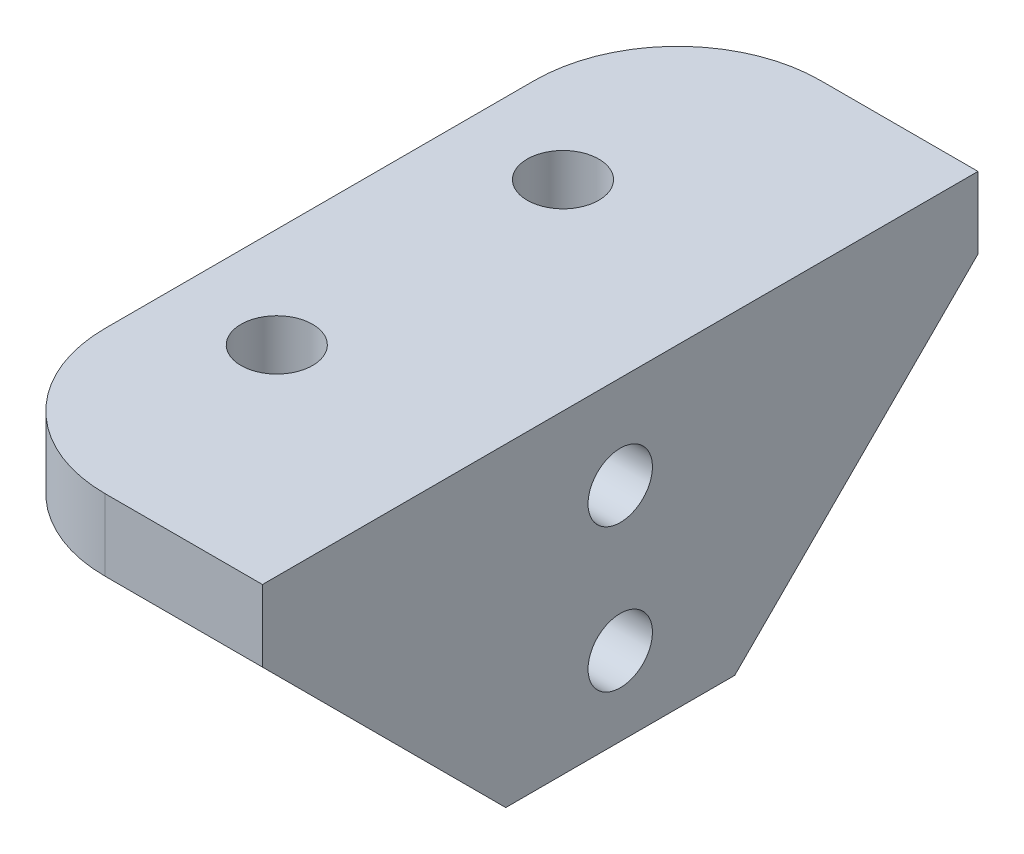
ISO-10303-21;
HEADER;
FILE_DESCRIPTION(('STEP AP214'),'2;1');
FILE_NAME('part.step','',(''),(''),'','','');
FILE_SCHEMA(('AUTOMOTIVE_DESIGN { 1 0 10303 214 1 1 1 1 }'));
ENDSEC;
DATA;
#1=APPLICATION_CONTEXT('core data for automotive mechanical design processes');
#2=APPLICATION_PROTOCOL_DEFINITION('international standard','automotive_design',2000,#1);
#3=PRODUCT_CONTEXT('',#1,'mechanical');
#4=PRODUCT('Part','Part','',(#3));
#5=PRODUCT_RELATED_PRODUCT_CATEGORY('part','',(#4));
#6=PRODUCT_DEFINITION_FORMATION('','',#4);
#7=PRODUCT_DEFINITION_CONTEXT('part definition',#1,'design');
#8=PRODUCT_DEFINITION('design','',#6,#7);
#9=PRODUCT_DEFINITION_SHAPE('','',#8);
#10=(LENGTH_UNIT() NAMED_UNIT(*) SI_UNIT(.MILLI.,.METRE.));
#11=(NAMED_UNIT(*) PLANE_ANGLE_UNIT() SI_UNIT($,.RADIAN.));
#12=(NAMED_UNIT(*) SI_UNIT($,.STERADIAN.) SOLID_ANGLE_UNIT());
#13=UNCERTAINTY_MEASURE_WITH_UNIT(LENGTH_MEASURE(1.E-05),#10,'distance_accuracy_value','');
#14=(GEOMETRIC_REPRESENTATION_CONTEXT(3) GLOBAL_UNCERTAINTY_ASSIGNED_CONTEXT((#13)) GLOBAL_UNIT_ASSIGNED_CONTEXT((#10,
#11,#12)) REPRESENTATION_CONTEXT('',''));
#15=CARTESIAN_POINT('',(0.,0.,0.));
#16=DIRECTION('',(0.,0.,1.));
#17=DIRECTION('',(1.,0.,0.));
#18=AXIS2_PLACEMENT_3D('',#15,#16,#17);
#19=CARTESIAN_POINT('',(15.,0.,0.));
#20=DIRECTION('',(1.,0.,0.));
#21=DIRECTION('',(0.,0.,-1.));
#22=AXIS2_PLACEMENT_3D('',#19,#20,#21);
#23=PLANE('',#22);
#24=DIRECTION('',(0.,0.,-1.));
#25=VECTOR('',#24,1.);
#26=CARTESIAN_POINT('',(15.,0.,0.));
#27=LINE('',#26,#25);
#28=CARTESIAN_POINT('',(15.,0.,0.));
#29=VERTEX_POINT('',#28);
#30=CARTESIAN_POINT('',(15.,0.,-21.2649464528604));
#31=VERTEX_POINT('',#30);
#32=EDGE_CURVE('E132',#29,#31,#27,.T.);
#33=ORIENTED_EDGE('',*,*,#32,.T.);
#34=CARTESIAN_POINT('',(15.,-1.49999999999999,-25.));
#35=DIRECTION('',(-1.,0.,0.));
#36=DIRECTION('',(0.,0.,1.));
#37=AXIS2_PLACEMENT_3D('',#34,#35,#36);
#38=CIRCLE('',#37,4.025);
#39=CARTESIAN_POINT('',(15.,0.,-28.7350535471396));
#40=VERTEX_POINT('',#39);
#41=EDGE_CURVE('E114',#40,#31,#38,.T.);
#42=ORIENTED_EDGE('',*,*,#41,.F.);
#43=CARTESIAN_POINT('',(15.,0.,-50.));
#44=VERTEX_POINT('',#43);
#45=EDGE_CURVE('E135',#40,#44,#27,.T.);
#46=ORIENTED_EDGE('',*,*,#45,.T.);
#47=DIRECTION('',(0.,0.707106781186548,-0.707106781186548));
#48=VECTOR('',#47,1.);
#49=CARTESIAN_POINT('',(15.,0.,-50.));
#50=LINE('',#49,#48);
#51=CARTESIAN_POINT('',(15.,-17.,-33.));
#52=VERTEX_POINT('',#51);
#53=EDGE_CURVE('E208',#52,#44,#50,.T.);
#54=ORIENTED_EDGE('',*,*,#53,.F.);
#55=DIRECTION('',(0.,0.,-1.));
#56=VECTOR('',#55,1.);
#57=CARTESIAN_POINT('',(15.,-17.,-17.));
#58=LINE('',#57,#56);
#59=CARTESIAN_POINT('',(15.,-17.,-17.));
#60=VERTEX_POINT('',#59);
#61=EDGE_CURVE('E202',#60,#52,#58,.T.);
#62=ORIENTED_EDGE('',*,*,#61,.F.);
#63=DIRECTION('',(0.,-0.707106781186547,-0.707106781186548));
#64=VECTOR('',#63,1.);
#65=CARTESIAN_POINT('',(15.,0.,0.));
#66=LINE('',#65,#64);
#67=EDGE_CURVE('E141',#29,#60,#66,.T.);
#68=ORIENTED_EDGE('',*,*,#67,.F.);
#69=EDGE_LOOP('',(#33,#42,#46,#54,#62,#68));
#70=FACE_BOUND('',#69,.T.);
#71=CARTESIAN_POINT('',(15.,-11.5,-25.));
#72=DIRECTION('',(-1.,0.,0.));
#73=DIRECTION('',(0.,0.,1.));
#74=AXIS2_PLACEMENT_3D('',#71,#72,#73);
#75=CIRCLE('',#74,4.025);
#76=CARTESIAN_POINT('',(15.,-11.5,-20.975));
#77=VERTEX_POINT('',#76);
#78=EDGE_CURVE('E261',#77,#77,#75,.T.);
#79=ORIENTED_EDGE('',*,*,#78,.F.);
#80=EDGE_LOOP('',(#79));
#81=FACE_BOUND('',#80,.T.);
#82=ADVANCED_FACE('F39',(#70,#81),#23,.F.);
#83=CARTESIAN_POINT('',(0.,5.,0.));
#84=DIRECTION('',(1.,0.,0.));
#85=DIRECTION('',(0.,0.,-1.));
#86=AXIS2_PLACEMENT_3D('',#83,#84,#85);
#87=PLANE('',#86);
#88=DIRECTION('',(0.,0.,1.));
#89=VECTOR('',#88,1.);
#90=CARTESIAN_POINT('',(0.,0.,0.));
#91=LINE('',#90,#89);
#92=CARTESIAN_POINT('',(0.,0.,-40.));
#93=VERTEX_POINT('',#92);
#94=CARTESIAN_POINT('',(0.,0.,-10.));
#95=VERTEX_POINT('',#94);
#96=EDGE_CURVE('E152',#93,#95,#91,.T.);
#97=ORIENTED_EDGE('',*,*,#96,.T.);
#98=DIRECTION('',(0.,-1.,0.));
#99=VECTOR('',#98,1.);
#100=CARTESIAN_POINT('',(0.,5.,-10.));
#101=LINE('',#100,#99);
#102=CARTESIAN_POINT('',(0.,5.,-10.));
#103=VERTEX_POINT('',#102);
#104=EDGE_CURVE('E321',#95,#103,#101,.F.);
#105=ORIENTED_EDGE('',*,*,#104,.T.);
#106=DIRECTION('',(0.,0.,1.));
#107=VECTOR('',#106,1.);
#108=CARTESIAN_POINT('',(0.,5.,0.));
#109=LINE('',#108,#107);
#110=CARTESIAN_POINT('',(0.,5.,-40.));
#111=VERTEX_POINT('',#110);
#112=EDGE_CURVE('E145',#111,#103,#109,.T.);
#113=ORIENTED_EDGE('',*,*,#112,.F.);
#114=DIRECTION('',(0.,-1.,0.));
#115=VECTOR('',#114,1.);
#116=CARTESIAN_POINT('',(0.,5.,-40.));
#117=LINE('',#116,#115);
#118=EDGE_CURVE('E331',#111,#93,#117,.T.);
#119=ORIENTED_EDGE('',*,*,#118,.T.);
#120=EDGE_LOOP('',(#97,#105,#113,#119));
#121=FACE_BOUND('',#120,.T.);
#122=ADVANCED_FACE('F268',(#121),#87,.F.);
#123=CARTESIAN_POINT('',(0.,5.,0.));
#124=DIRECTION('',(0.,0.,-1.));
#125=DIRECTION('',(-1.,0.,0.));
#126=AXIS2_PLACEMENT_3D('',#123,#124,#125);
#127=PLANE('',#126);
#128=DIRECTION('',(1.,0.,0.));
#129=VECTOR('',#128,1.);
#130=CARTESIAN_POINT('',(0.,5.,0.));
#131=LINE('',#130,#129);
#132=CARTESIAN_POINT('',(10.,5.,0.));
#133=VERTEX_POINT('',#132);
#134=CARTESIAN_POINT('',(21.,5.,0.));
#135=VERTEX_POINT('',#134);
#136=EDGE_CURVE('E165',#133,#135,#131,.T.);
#137=ORIENTED_EDGE('',*,*,#136,.F.);
#138=DIRECTION('',(0.,-1.,0.));
#139=VECTOR('',#138,1.);
#140=CARTESIAN_POINT('',(10.,5.,0.));
#141=LINE('',#140,#139);
#142=CARTESIAN_POINT('',(10.,0.,0.));
#143=VERTEX_POINT('',#142);
#144=EDGE_CURVE('E164',#133,#143,#141,.T.);
#145=ORIENTED_EDGE('',*,*,#144,.T.);
#146=DIRECTION('',(1.,0.,0.));
#147=VECTOR('',#146,1.);
#148=CARTESIAN_POINT('',(0.,0.,0.));
#149=LINE('',#148,#147);
#150=EDGE_CURVE('E149',#143,#29,#149,.T.);
#151=ORIENTED_EDGE('',*,*,#150,.T.);
#152=DIRECTION('',(-1.,0.,0.));
#153=VECTOR('',#152,1.);
#154=CARTESIAN_POINT('',(21.,0.,0.));
#155=LINE('',#154,#153);
#156=CARTESIAN_POINT('',(21.,0.,0.));
#157=VERTEX_POINT('',#156);
#158=EDGE_CURVE('E190',#157,#29,#155,.T.);
#159=ORIENTED_EDGE('',*,*,#158,.F.);
#160=DIRECTION('',(0.,-1.,0.));
#161=VECTOR('',#160,1.);
#162=CARTESIAN_POINT('',(21.,5.,0.));
#163=LINE('',#162,#161);
#164=EDGE_CURVE('E218',#135,#157,#163,.T.);
#165=ORIENTED_EDGE('',*,*,#164,.F.);
#166=EDGE_LOOP('',(#137,#145,#151,#159,#165));
#167=FACE_BOUND('',#166,.T.);
#168=ADVANCED_FACE('F275',(#167),#127,.F.);
#169=CARTESIAN_POINT('',(0.,5.,-50.));
#170=DIRECTION('',(0.,0.,1.));
#171=DIRECTION('',(1.,0.,0.));
#172=AXIS2_PLACEMENT_3D('',#169,#170,#171);
#173=PLANE('',#172);
#174=DIRECTION('',(-1.,0.,0.));
#175=VECTOR('',#174,1.);
#176=CARTESIAN_POINT('',(0.,0.,-50.));
#177=LINE('',#176,#175);
#178=CARTESIAN_POINT('',(10.,0.,-50.));
#179=VERTEX_POINT('',#178);
#180=EDGE_CURVE('E143',#44,#179,#177,.T.);
#181=ORIENTED_EDGE('',*,*,#180,.T.);
#182=DIRECTION('',(0.,-1.,0.));
#183=VECTOR('',#182,1.);
#184=CARTESIAN_POINT('',(10.,5.,-50.));
#185=LINE('',#184,#183);
#186=CARTESIAN_POINT('',(10.,5.,-50.));
#187=VERTEX_POINT('',#186);
#188=EDGE_CURVE('E11',#179,#187,#185,.F.);
#189=ORIENTED_EDGE('',*,*,#188,.T.);
#190=DIRECTION('',(-1.,0.,0.));
#191=VECTOR('',#190,1.);
#192=CARTESIAN_POINT('',(0.,5.,-50.));
#193=LINE('',#192,#191);
#194=CARTESIAN_POINT('',(21.,5.,-50.));
#195=VERTEX_POINT('',#194);
#196=EDGE_CURVE('E161',#195,#187,#193,.T.);
#197=ORIENTED_EDGE('',*,*,#196,.F.);
#198=DIRECTION('',(0.,1.,0.));
#199=VECTOR('',#198,1.);
#200=CARTESIAN_POINT('',(21.,5.,-50.));
#201=LINE('',#200,#199);
#202=CARTESIAN_POINT('',(21.,0.,-50.));
#203=VERTEX_POINT('',#202);
#204=EDGE_CURVE('E225',#203,#195,#201,.T.);
#205=ORIENTED_EDGE('',*,*,#204,.F.);
#206=DIRECTION('',(-1.,0.,0.));
#207=VECTOR('',#206,1.);
#208=CARTESIAN_POINT('',(21.,0.,-50.));
#209=LINE('',#208,#207);
#210=EDGE_CURVE('E176',#203,#44,#209,.T.);
#211=ORIENTED_EDGE('',*,*,#210,.T.);
#212=EDGE_LOOP('',(#181,#189,#197,#205,#211));
#213=FACE_BOUND('',#212,.T.);
#214=ADVANCED_FACE('F306',(#213),#173,.F.);
#215=CARTESIAN_POINT('',(0.,5.,0.));
#216=DIRECTION('',(0.,-1.,0.));
#217=DIRECTION('',(0.,0.,-1.));
#218=AXIS2_PLACEMENT_3D('',#215,#216,#217);
#219=PLANE('',#218);
#220=CARTESIAN_POINT('',(6.99999999999999,5.,-35.));
#221=DIRECTION('',(0.,1.,0.));
#222=DIRECTION('',(0.,0.,1.));
#223=AXIS2_PLACEMENT_3D('',#220,#221,#222);
#224=CIRCLE('',#223,2.5);
#225=CARTESIAN_POINT('',(6.99999999999999,5.,-32.5));
#226=VERTEX_POINT('',#225);
#227=EDGE_CURVE('E180',#226,#226,#224,.T.);
#228=ORIENTED_EDGE('',*,*,#227,.F.);
#229=EDGE_LOOP('',(#228));
#230=FACE_BOUND('',#229,.T.);
#231=CARTESIAN_POINT('',(6.99999999999999,5.,-15.));
#232=DIRECTION('',(0.,1.,0.));
#233=DIRECTION('',(0.,0.,1.));
#234=AXIS2_PLACEMENT_3D('',#231,#232,#233);
#235=CIRCLE('',#234,2.5);
#236=CARTESIAN_POINT('',(6.99999999999999,5.,-12.5));
#237=VERTEX_POINT('',#236);
#238=EDGE_CURVE('E171',#237,#237,#235,.T.);
#239=ORIENTED_EDGE('',*,*,#238,.F.);
#240=EDGE_LOOP('',(#239));
#241=FACE_BOUND('',#240,.T.);
#242=ORIENTED_EDGE('',*,*,#112,.T.);
#243=CARTESIAN_POINT('',(10.,5.,-10.));
#244=DIRECTION('',(0.,-1.,0.));
#245=DIRECTION('',(0.,0.,-1.));
#246=AXIS2_PLACEMENT_3D('',#243,#244,#245);
#247=CIRCLE('',#246,10.);
#248=EDGE_CURVE('E48',#103,#133,#247,.F.);
#249=ORIENTED_EDGE('',*,*,#248,.T.);
#250=ORIENTED_EDGE('',*,*,#136,.T.);
#251=DIRECTION('',(0.,0.,1.));
#252=VECTOR('',#251,1.);
#253=CARTESIAN_POINT('',(21.,5.,-50.));
#254=LINE('',#253,#252);
#255=EDGE_CURVE('E221',#195,#135,#254,.T.);
#256=ORIENTED_EDGE('',*,*,#255,.F.);
#257=ORIENTED_EDGE('',*,*,#196,.T.);
#258=CARTESIAN_POINT('',(10.,5.,-40.));
#259=DIRECTION('',(0.,-1.,0.));
#260=DIRECTION('',(0.,0.,-1.));
#261=AXIS2_PLACEMENT_3D('',#258,#259,#260);
#262=CIRCLE('',#261,10.);
#263=EDGE_CURVE('E325',#187,#111,#262,.F.);
#264=ORIENTED_EDGE('',*,*,#263,.T.);
#265=EDGE_LOOP('',(#242,#249,#250,#256,#257,#264));
#266=FACE_BOUND('',#265,.T.);
#267=ADVANCED_FACE('F303',(#230,#241,#266),#219,.F.);
#268=CARTESIAN_POINT('',(0.,0.,0.));
#269=DIRECTION('',(0.,-1.,0.));
#270=DIRECTION('',(0.,0.,-1.));
#271=AXIS2_PLACEMENT_3D('',#268,#269,#270);
#272=PLANE('',#271);
#273=CARTESIAN_POINT('',(6.99999999999999,0.,-35.));
#274=DIRECTION('',(0.,1.,0.));
#275=DIRECTION('',(0.,0.,1.));
#276=AXIS2_PLACEMENT_3D('',#273,#274,#275);
#277=CIRCLE('',#276,2.5);
#278=CARTESIAN_POINT('',(6.99999999999999,0.,-32.5));
#279=VERTEX_POINT('',#278);
#280=EDGE_CURVE('E158',#279,#279,#277,.T.);
#281=ORIENTED_EDGE('',*,*,#280,.T.);
#282=EDGE_LOOP('',(#281));
#283=FACE_BOUND('',#282,.T.);
#284=CARTESIAN_POINT('',(6.99999999999999,0.,-15.));
#285=DIRECTION('',(0.,1.,0.));
#286=DIRECTION('',(0.,0.,1.));
#287=AXIS2_PLACEMENT_3D('',#284,#285,#286);
#288=CIRCLE('',#287,2.5);
#289=CARTESIAN_POINT('',(6.99999999999999,0.,-12.5));
#290=VERTEX_POINT('',#289);
#291=EDGE_CURVE('E175',#290,#290,#288,.T.);
#292=ORIENTED_EDGE('',*,*,#291,.T.);
#293=EDGE_LOOP('',(#292));
#294=FACE_BOUND('',#293,.T.);
#295=ORIENTED_EDGE('',*,*,#150,.F.);
#296=CARTESIAN_POINT('',(10.,0.,-10.));
#297=DIRECTION('',(0.,-1.,0.));
#298=DIRECTION('',(0.,0.,-1.));
#299=AXIS2_PLACEMENT_3D('',#296,#297,#298);
#300=CIRCLE('',#299,10.);
#301=EDGE_CURVE('E335',#143,#95,#300,.T.);
#302=ORIENTED_EDGE('',*,*,#301,.T.);
#303=ORIENTED_EDGE('',*,*,#96,.F.);
#304=CARTESIAN_POINT('',(10.,0.,-40.));
#305=DIRECTION('',(0.,-1.,0.));
#306=DIRECTION('',(0.,0.,-1.));
#307=AXIS2_PLACEMENT_3D('',#304,#305,#306);
#308=CIRCLE('',#307,10.);
#309=EDGE_CURVE('E338',#93,#179,#308,.T.);
#310=ORIENTED_EDGE('',*,*,#309,.T.);
#311=ORIENTED_EDGE('',*,*,#180,.F.);
#312=ORIENTED_EDGE('',*,*,#45,.F.);
#313=EDGE_CURVE('E125',#31,#40,#27,.T.);
#314=ORIENTED_EDGE('',*,*,#313,.F.);
#315=ORIENTED_EDGE('',*,*,#32,.F.);
#316=EDGE_LOOP('',(#295,#302,#303,#310,#311,#312,#314,#315));
#317=FACE_BOUND('',#316,.T.);
#318=ADVANCED_FACE('F131',(#283,#294,#317),#272,.T.);
#319=CARTESIAN_POINT('',(6.99999999999999,0.,-15.));
#320=DIRECTION('',(0.,1.,0.));
#321=DIRECTION('',(0.,0.,1.));
#322=AXIS2_PLACEMENT_3D('',#319,#320,#321);
#323=CYLINDRICAL_SURFACE('',#322,2.5);
#324=ORIENTED_EDGE('',*,*,#291,.F.);
#325=EDGE_LOOP('',(#324));
#326=FACE_BOUND('',#325,.T.);
#327=ORIENTED_EDGE('',*,*,#238,.T.);
#328=EDGE_LOOP('',(#327));
#329=FACE_BOUND('',#328,.T.);
#330=ADVANCED_FACE('F298',(#326,#329),#323,.F.);
#331=CARTESIAN_POINT('',(6.99999999999999,0.,-35.));
#332=DIRECTION('',(0.,1.,0.));
#333=DIRECTION('',(0.,0.,1.));
#334=AXIS2_PLACEMENT_3D('',#331,#332,#333);
#335=CYLINDRICAL_SURFACE('',#334,2.5);
#336=ORIENTED_EDGE('',*,*,#280,.F.);
#337=EDGE_LOOP('',(#336));
#338=FACE_BOUND('',#337,.T.);
#339=ORIENTED_EDGE('',*,*,#227,.T.);
#340=EDGE_LOOP('',(#339));
#341=FACE_BOUND('',#340,.T.);
#342=ADVANCED_FACE('F294',(#338,#341),#335,.F.);
#343=CARTESIAN_POINT('',(10.,5.,-10.));
#344=DIRECTION('',(0.,-1.,0.));
#345=DIRECTION('',(0.,0.,-1.));
#346=AXIS2_PLACEMENT_3D('',#343,#344,#345);
#347=CYLINDRICAL_SURFACE('',#346,10.);
#348=ORIENTED_EDGE('',*,*,#248,.F.);
#349=ORIENTED_EDGE('',*,*,#104,.F.);
#350=ORIENTED_EDGE('',*,*,#301,.F.);
#351=ORIENTED_EDGE('',*,*,#144,.F.);
#352=EDGE_LOOP('',(#348,#349,#350,#351));
#353=FACE_BOUND('',#352,.T.);
#354=ADVANCED_FACE('F297',(#353),#347,.T.);
#355=CARTESIAN_POINT('',(10.,5.,-40.));
#356=DIRECTION('',(0.,-1.,0.));
#357=DIRECTION('',(0.,0.,-1.));
#358=AXIS2_PLACEMENT_3D('',#355,#356,#357);
#359=CYLINDRICAL_SURFACE('',#358,10.);
#360=ORIENTED_EDGE('',*,*,#263,.F.);
#361=ORIENTED_EDGE('',*,*,#188,.F.);
#362=ORIENTED_EDGE('',*,*,#309,.F.);
#363=ORIENTED_EDGE('',*,*,#118,.F.);
#364=EDGE_LOOP('',(#360,#361,#362,#363));
#365=FACE_BOUND('',#364,.T.);
#366=ADVANCED_FACE('F41',(#365),#359,.T.);
#367=CARTESIAN_POINT('',(21.,0.,-50.));
#368=DIRECTION('',(0.,0.707106781186547,0.707106781186547));
#369=DIRECTION('',(0.,-0.707106781186548,0.707106781186548));
#370=AXIS2_PLACEMENT_3D('',#367,#368,#369);
#371=PLANE('',#370);
#372=ORIENTED_EDGE('',*,*,#53,.T.);
#373=ORIENTED_EDGE('',*,*,#210,.F.);
#374=DIRECTION('',(0.,0.707106781186548,-0.707106781186548));
#375=VECTOR('',#374,1.);
#376=CARTESIAN_POINT('',(21.,0.,-50.));
#377=LINE('',#376,#375);
#378=CARTESIAN_POINT('',(21.,-17.,-33.));
#379=VERTEX_POINT('',#378);
#380=EDGE_CURVE('E205',#379,#203,#377,.T.);
#381=ORIENTED_EDGE('',*,*,#380,.F.);
#382=DIRECTION('',(-1.,0.,0.));
#383=VECTOR('',#382,1.);
#384=CARTESIAN_POINT('',(21.,-17.,-33.));
#385=LINE('',#384,#383);
#386=EDGE_CURVE('E197',#379,#52,#385,.T.);
#387=ORIENTED_EDGE('',*,*,#386,.T.);
#388=EDGE_LOOP('',(#372,#373,#381,#387));
#389=FACE_BOUND('',#388,.T.);
#390=ADVANCED_FACE('F289',(#389),#371,.F.);
#391=CARTESIAN_POINT('',(21.,0.,0.));
#392=DIRECTION('',(0.,0.707106781186548,-0.707106781186547));
#393=DIRECTION('',(0.,0.707106781186547,0.707106781186548));
#394=AXIS2_PLACEMENT_3D('',#391,#392,#393);
#395=PLANE('',#394);
#396=ORIENTED_EDGE('',*,*,#67,.T.);
#397=DIRECTION('',(-1.,0.,0.));
#398=VECTOR('',#397,1.);
#399=CARTESIAN_POINT('',(21.,-17.,-17.));
#400=LINE('',#399,#398);
#401=CARTESIAN_POINT('',(21.,-17.,-17.));
#402=VERTEX_POINT('',#401);
#403=EDGE_CURVE('E193',#402,#60,#400,.T.);
#404=ORIENTED_EDGE('',*,*,#403,.F.);
#405=DIRECTION('',(0.,-0.707106781186547,-0.707106781186548));
#406=VECTOR('',#405,1.);
#407=CARTESIAN_POINT('',(21.,0.,0.));
#408=LINE('',#407,#406);
#409=EDGE_CURVE('E215',#157,#402,#408,.T.);
#410=ORIENTED_EDGE('',*,*,#409,.F.);
#411=ORIENTED_EDGE('',*,*,#158,.T.);
#412=EDGE_LOOP('',(#396,#404,#410,#411));
#413=FACE_BOUND('',#412,.T.);
#414=ADVANCED_FACE('F285',(#413),#395,.F.);
#415=CARTESIAN_POINT('',(21.,-17.,-17.));
#416=DIRECTION('',(0.,1.,0.));
#417=DIRECTION('',(0.,0.,1.));
#418=AXIS2_PLACEMENT_3D('',#415,#416,#417);
#419=PLANE('',#418);
#420=ORIENTED_EDGE('',*,*,#61,.T.);
#421=ORIENTED_EDGE('',*,*,#386,.F.);
#422=DIRECTION('',(0.,0.,-1.));
#423=VECTOR('',#422,1.);
#424=CARTESIAN_POINT('',(21.,-17.,-17.));
#425=LINE('',#424,#423);
#426=EDGE_CURVE('E201',#402,#379,#425,.T.);
#427=ORIENTED_EDGE('',*,*,#426,.F.);
#428=ORIENTED_EDGE('',*,*,#403,.T.);
#429=EDGE_LOOP('',(#420,#421,#427,#428));
#430=FACE_BOUND('',#429,.T.);
#431=ADVANCED_FACE('F282',(#430),#419,.F.);
#432=CARTESIAN_POINT('',(21.,0.,0.));
#433=DIRECTION('',(1.,0.,0.));
#434=DIRECTION('',(0.,0.,-1.));
#435=AXIS2_PLACEMENT_3D('',#432,#433,#434);
#436=PLANE('',#435);
#437=CARTESIAN_POINT('',(21.,-11.5,-25.));
#438=DIRECTION('',(-1.,0.,0.));
#439=DIRECTION('',(0.,0.,1.));
#440=AXIS2_PLACEMENT_3D('',#437,#438,#439);
#441=CIRCLE('',#440,2.25);
#442=CARTESIAN_POINT('',(21.,-11.5,-22.75));
#443=VERTEX_POINT('',#442);
#444=EDGE_CURVE('E120',#443,#443,#441,.T.);
#445=ORIENTED_EDGE('',*,*,#444,.T.);
#446=EDGE_LOOP('',(#445));
#447=FACE_BOUND('',#446,.T.);
#448=CARTESIAN_POINT('',(21.,-1.49999999999999,-25.));
#449=DIRECTION('',(-1.,0.,0.));
#450=DIRECTION('',(0.,0.,1.));
#451=AXIS2_PLACEMENT_3D('',#448,#449,#450);
#452=CIRCLE('',#451,2.25);
#453=CARTESIAN_POINT('',(21.,-1.49999999999999,-22.75));
#454=VERTEX_POINT('',#453);
#455=EDGE_CURVE('E212',#454,#454,#452,.T.);
#456=ORIENTED_EDGE('',*,*,#455,.T.);
#457=EDGE_LOOP('',(#456));
#458=FACE_BOUND('',#457,.T.);
#459=ORIENTED_EDGE('',*,*,#380,.T.);
#460=ORIENTED_EDGE('',*,*,#204,.T.);
#461=ORIENTED_EDGE('',*,*,#255,.T.);
#462=ORIENTED_EDGE('',*,*,#164,.T.);
#463=ORIENTED_EDGE('',*,*,#409,.T.);
#464=ORIENTED_EDGE('',*,*,#426,.T.);
#465=EDGE_LOOP('',(#459,#460,#461,#462,#463,#464));
#466=FACE_BOUND('',#465,.T.);
#467=ADVANCED_FACE('F280',(#447,#458,#466),#436,.T.);
#468=CARTESIAN_POINT('',(15.,2.52500000000001,-25.));
#469=DIRECTION('',(-1.,0.,0.));
#470=DIRECTION('',(0.,0.,1.));
#471=AXIS2_PLACEMENT_3D('',#468,#469,#470);
#472=PLANE('',#471);
#473=ORIENTED_EDGE('',*,*,#313,.T.);
#474=EDGE_CURVE('E54',#31,#40,#38,.T.);
#475=ORIENTED_EDGE('',*,*,#474,.F.);
#476=EDGE_LOOP('',(#473,#475));
#477=FACE_BOUND('',#476,.T.);
#478=ADVANCED_FACE('F124',(#477),#472,.F.);
#479=CARTESIAN_POINT('',(15.,-1.49999999999999,-25.));
#480=DIRECTION('',(-1.,0.,0.));
#481=DIRECTION('',(0.,0.,1.));
#482=AXIS2_PLACEMENT_3D('',#479,#480,#481);
#483=CYLINDRICAL_SURFACE('',#482,2.25);
#484=ORIENTED_EDGE('',*,*,#455,.F.);
#485=EDGE_LOOP('',(#484));
#486=FACE_BOUND('',#485,.T.);
#487=CARTESIAN_POINT('',(17.6,-1.49999999999999,-25.));
#488=DIRECTION('',(-1.,0.,0.));
#489=DIRECTION('',(0.,0.,1.));
#490=AXIS2_PLACEMENT_3D('',#487,#488,#489);
#491=CIRCLE('',#490,2.25);
#492=CARTESIAN_POINT('',(17.6,-1.49999999999999,-22.75));
#493=VERTEX_POINT('',#492);
#494=EDGE_CURVE('E235',#493,#493,#491,.T.);
#495=ORIENTED_EDGE('',*,*,#494,.T.);
#496=EDGE_LOOP('',(#495));
#497=FACE_BOUND('',#496,.T.);
#498=ADVANCED_FACE('F360',(#486,#497),#483,.F.);
#499=CARTESIAN_POINT('',(17.6,2.50000000000001,-25.));
#500=DIRECTION('',(1.,0.,0.));
#501=DIRECTION('',(0.,0.,-1.));
#502=AXIS2_PLACEMENT_3D('',#499,#500,#501);
#503=PLANE('',#502);
#504=ORIENTED_EDGE('',*,*,#494,.F.);
#505=EDGE_LOOP('',(#504));
#506=FACE_BOUND('',#505,.T.);
#507=CARTESIAN_POINT('',(17.6,-1.49999999999999,-25.));
#508=DIRECTION('',(-1.,0.,0.));
#509=DIRECTION('',(0.,0.,1.));
#510=AXIS2_PLACEMENT_3D('',#507,#508,#509);
#511=CIRCLE('',#510,4.);
#512=CARTESIAN_POINT('',(17.6,-1.49999999999999,-21.));
#513=VERTEX_POINT('',#512);
#514=EDGE_CURVE('E239',#513,#513,#511,.T.);
#515=ORIENTED_EDGE('',*,*,#514,.T.);
#516=EDGE_LOOP('',(#515));
#517=FACE_BOUND('',#516,.T.);
#518=ADVANCED_FACE('F367',(#506,#517),#503,.F.);
#519=CARTESIAN_POINT('',(15.,-1.49999999999999,-25.));
#520=DIRECTION('',(-1.,0.,0.));
#521=DIRECTION('',(0.,0.,1.));
#522=AXIS2_PLACEMENT_3D('',#519,#520,#521);
#523=CYLINDRICAL_SURFACE('',#522,4.);
#524=ORIENTED_EDGE('',*,*,#514,.F.);
#525=EDGE_LOOP('',(#524));
#526=FACE_BOUND('',#525,.T.);
#527=CARTESIAN_POINT('',(15.025,-1.49999999999999,-25.));
#528=DIRECTION('',(-1.,0.,0.));
#529=DIRECTION('',(0.,0.,1.));
#530=AXIS2_PLACEMENT_3D('',#527,#528,#529);
#531=CIRCLE('',#530,4.);
#532=CARTESIAN_POINT('',(15.025,-1.49999999999999,-21.));
#533=VERTEX_POINT('',#532);
#534=EDGE_CURVE('E127',#533,#533,#531,.T.);
#535=ORIENTED_EDGE('',*,*,#534,.T.);
#536=EDGE_LOOP('',(#535));
#537=FACE_BOUND('',#536,.T.);
#538=ADVANCED_FACE('F373',(#526,#537),#523,.F.);
#539=CARTESIAN_POINT('',(15.,-1.49999999999999,-25.));
#540=DIRECTION('',(-1.,0.,0.));
#541=DIRECTION('',(0.,0.,1.));
#542=AXIS2_PLACEMENT_3D('',#539,#540,#541);
#543=CONICAL_SURFACE('',#542,4.025,0.785398163397448);
#544=ORIENTED_EDGE('',*,*,#534,.F.);
#545=EDGE_LOOP('',(#544));
#546=FACE_BOUND('',#545,.T.);
#547=ORIENTED_EDGE('',*,*,#474,.T.);
#548=ORIENTED_EDGE('',*,*,#41,.T.);
#549=EDGE_LOOP('',(#547,#548));
#550=FACE_BOUND('',#549,.T.);
#551=ADVANCED_FACE('F115',(#546,#550),#543,.F.);
#552=CARTESIAN_POINT('',(15.,-11.5,-25.));
#553=DIRECTION('',(-1.,0.,0.));
#554=DIRECTION('',(0.,0.,1.));
#555=AXIS2_PLACEMENT_3D('',#552,#553,#554);
#556=CYLINDRICAL_SURFACE('',#555,2.25);
#557=ORIENTED_EDGE('',*,*,#444,.F.);
#558=EDGE_LOOP('',(#557));
#559=FACE_BOUND('',#558,.T.);
#560=CARTESIAN_POINT('',(17.6,-11.5,-25.));
#561=DIRECTION('',(-1.,0.,0.));
#562=DIRECTION('',(0.,0.,1.));
#563=AXIS2_PLACEMENT_3D('',#560,#561,#562);
#564=CIRCLE('',#563,2.25);
#565=CARTESIAN_POINT('',(17.6,-11.5,-22.75));
#566=VERTEX_POINT('',#565);
#567=EDGE_CURVE('E249',#566,#566,#564,.T.);
#568=ORIENTED_EDGE('',*,*,#567,.T.);
#569=EDGE_LOOP('',(#568));
#570=FACE_BOUND('',#569,.T.);
#571=ADVANCED_FACE('F383',(#559,#570),#556,.F.);
#572=CARTESIAN_POINT('',(17.6,-7.49999999999999,-25.));
#573=DIRECTION('',(1.,0.,0.));
#574=DIRECTION('',(0.,0.,-1.));
#575=AXIS2_PLACEMENT_3D('',#572,#573,#574);
#576=PLANE('',#575);
#577=ORIENTED_EDGE('',*,*,#567,.F.);
#578=EDGE_LOOP('',(#577));
#579=FACE_BOUND('',#578,.T.);
#580=CARTESIAN_POINT('',(17.6,-11.5,-25.));
#581=DIRECTION('',(-1.,0.,0.));
#582=DIRECTION('',(0.,0.,1.));
#583=AXIS2_PLACEMENT_3D('',#580,#581,#582);
#584=CIRCLE('',#583,4.);
#585=CARTESIAN_POINT('',(17.6,-11.5,-21.));
#586=VERTEX_POINT('',#585);
#587=EDGE_CURVE('E253',#586,#586,#584,.T.);
#588=ORIENTED_EDGE('',*,*,#587,.T.);
#589=EDGE_LOOP('',(#588));
#590=FACE_BOUND('',#589,.T.);
#591=ADVANCED_FACE('F388',(#579,#590),#576,.F.);
#592=CARTESIAN_POINT('',(15.,-11.5,-25.));
#593=DIRECTION('',(-1.,0.,0.));
#594=DIRECTION('',(0.,0.,1.));
#595=AXIS2_PLACEMENT_3D('',#592,#593,#594);
#596=CYLINDRICAL_SURFACE('',#595,4.);
#597=ORIENTED_EDGE('',*,*,#587,.F.);
#598=EDGE_LOOP('',(#597));
#599=FACE_BOUND('',#598,.T.);
#600=CARTESIAN_POINT('',(15.025,-11.5,-25.));
#601=DIRECTION('',(-1.,0.,0.));
#602=DIRECTION('',(0.,0.,1.));
#603=AXIS2_PLACEMENT_3D('',#600,#601,#602);
#604=CIRCLE('',#603,4.);
#605=CARTESIAN_POINT('',(15.025,-11.5,-21.));
#606=VERTEX_POINT('',#605);
#607=EDGE_CURVE('E257',#606,#606,#604,.T.);
#608=ORIENTED_EDGE('',*,*,#607,.T.);
#609=EDGE_LOOP('',(#608));
#610=FACE_BOUND('',#609,.T.);
#611=ADVANCED_FACE('F394',(#599,#610),#596,.F.);
#612=CARTESIAN_POINT('',(15.,-11.5,-25.));
#613=DIRECTION('',(-1.,0.,0.));
#614=DIRECTION('',(0.,0.,1.));
#615=AXIS2_PLACEMENT_3D('',#612,#613,#614);
#616=CONICAL_SURFACE('',#615,4.025,0.785398163397448);
#617=ORIENTED_EDGE('',*,*,#607,.F.);
#618=EDGE_LOOP('',(#617));
#619=FACE_BOUND('',#618,.T.);
#620=ORIENTED_EDGE('',*,*,#78,.T.);
#621=EDGE_LOOP('',(#620));
#622=FACE_BOUND('',#621,.T.);
#623=ADVANCED_FACE('F266',(#619,#622),#616,.F.);
#624=CLOSED_SHELL('',(#82,#122,#168,#214,#267,#318,#330,#342,#354,#366,#390,#414,#431,#467,#478,
#498,#518,#538,#551,#571,#591,#611,#623));
#625=MANIFOLD_SOLID_BREP('B2',#624);
#626=ADVANCED_BREP_SHAPE_REPRESENTATION('',(#18,#625),#14);
#627=SHAPE_DEFINITION_REPRESENTATION(#9,#626);
ENDSEC;
END-ISO-10303-21;
